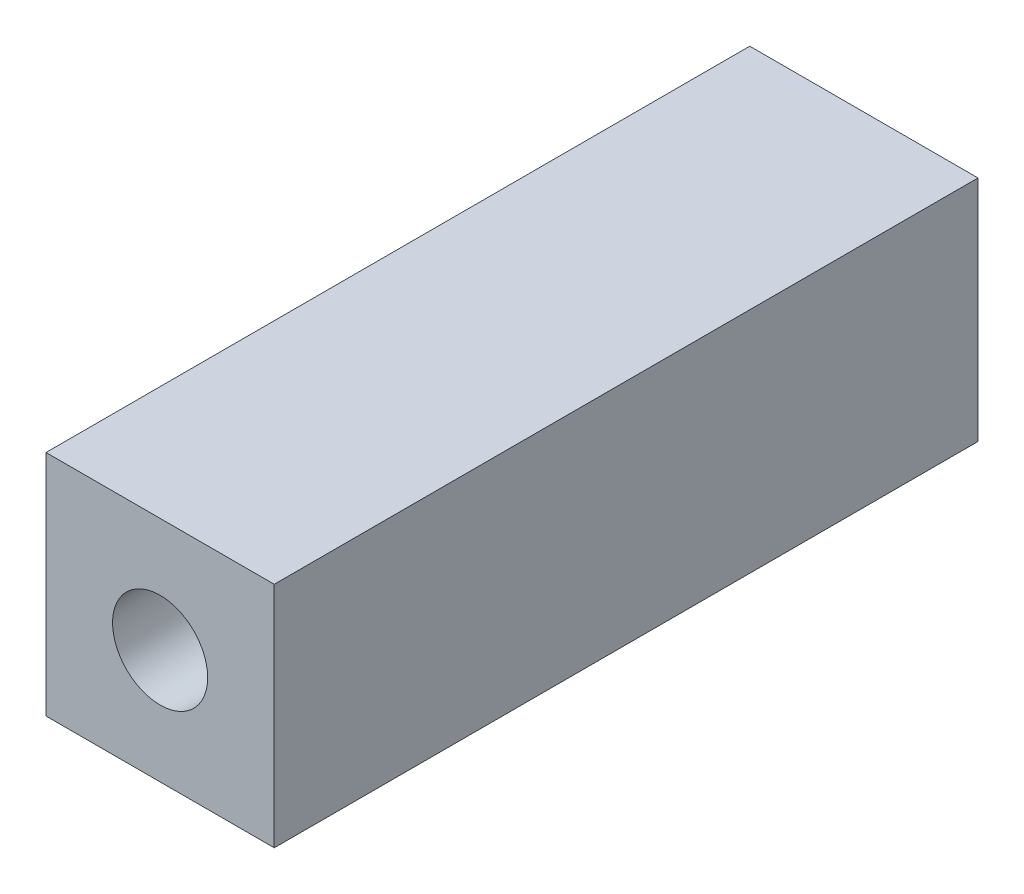
ISO-10303-21;
HEADER;
FILE_DESCRIPTION(('STEP AP214'),'2;1');
FILE_NAME('part.step','',(''),(''),'','','');
FILE_SCHEMA(('AUTOMOTIVE_DESIGN { 1 0 10303 214 1 1 1 1 }'));
ENDSEC;
DATA;
#1=APPLICATION_CONTEXT('core data for automotive mechanical design processes');
#2=APPLICATION_PROTOCOL_DEFINITION('international standard','automotive_design',2000,#1);
#3=PRODUCT_CONTEXT('',#1,'mechanical');
#4=PRODUCT('Part','Part','',(#3));
#5=PRODUCT_RELATED_PRODUCT_CATEGORY('part','',(#4));
#6=PRODUCT_DEFINITION_FORMATION('','',#4);
#7=PRODUCT_DEFINITION_CONTEXT('part definition',#1,'design');
#8=PRODUCT_DEFINITION('design','',#6,#7);
#9=PRODUCT_DEFINITION_SHAPE('','',#8);
#10=(LENGTH_UNIT() NAMED_UNIT(*) SI_UNIT(.MILLI.,.METRE.));
#11=(NAMED_UNIT(*) PLANE_ANGLE_UNIT() SI_UNIT($,.RADIAN.));
#12=(NAMED_UNIT(*) SI_UNIT($,.STERADIAN.) SOLID_ANGLE_UNIT());
#13=UNCERTAINTY_MEASURE_WITH_UNIT(LENGTH_MEASURE(1.E-05),#10,'distance_accuracy_value','');
#14=(GEOMETRIC_REPRESENTATION_CONTEXT(3) GLOBAL_UNCERTAINTY_ASSIGNED_CONTEXT((#13)) GLOBAL_UNIT_ASSIGNED_CONTEXT((#10,
#11,#12)) REPRESENTATION_CONTEXT('',''));
#15=CARTESIAN_POINT('',(0.,0.,0.));
#16=DIRECTION('',(0.,0.,1.));
#17=DIRECTION('',(1.,0.,0.));
#18=AXIS2_PLACEMENT_3D('',#15,#16,#17);
#19=CARTESIAN_POINT('',(6.,6.,37.));
#20=DIRECTION('',(-1.,0.,0.));
#21=DIRECTION('',(0.,-1.,0.));
#22=AXIS2_PLACEMENT_3D('',#19,#20,#21);
#23=PLANE('',#22);
#24=DIRECTION('',(0.,1.,0.));
#25=VECTOR('',#24,1.);
#26=CARTESIAN_POINT('',(6.,6.,0.));
#27=LINE('',#26,#25);
#28=CARTESIAN_POINT('',(6.,-6.,0.));
#29=VERTEX_POINT('',#28);
#30=CARTESIAN_POINT('',(6.,6.,0.));
#31=VERTEX_POINT('',#30);
#32=EDGE_CURVE('E147',#29,#31,#27,.T.);
#33=ORIENTED_EDGE('',*,*,#32,.T.);
#34=DIRECTION('',(0.,0.,-1.));
#35=VECTOR('',#34,1.);
#36=CARTESIAN_POINT('',(6.,6.,37.));
#37=LINE('',#36,#35);
#38=CARTESIAN_POINT('',(6.,6.,37.));
#39=VERTEX_POINT('',#38);
#40=EDGE_CURVE('E11',#39,#31,#37,.T.);
#41=ORIENTED_EDGE('',*,*,#40,.F.);
#42=DIRECTION('',(0.,1.,0.));
#43=VECTOR('',#42,1.);
#44=CARTESIAN_POINT('',(6.,6.,37.));
#45=LINE('',#44,#43);
#46=CARTESIAN_POINT('',(6.,-6.,37.));
#47=VERTEX_POINT('',#46);
#48=EDGE_CURVE('E151',#47,#39,#45,.T.);
#49=ORIENTED_EDGE('',*,*,#48,.F.);
#50=DIRECTION('',(0.,0.,-1.));
#51=VECTOR('',#50,1.);
#52=CARTESIAN_POINT('',(6.,-6.,37.));
#53=LINE('',#52,#51);
#54=EDGE_CURVE('E157',#47,#29,#53,.T.);
#55=ORIENTED_EDGE('',*,*,#54,.T.);
#56=EDGE_LOOP('',(#33,#41,#49,#55));
#57=FACE_BOUND('',#56,.T.);
#58=ADVANCED_FACE('F36',(#57),#23,.F.);
#59=CARTESIAN_POINT('',(-6.,6.,37.));
#60=DIRECTION('',(0.,-1.,0.));
#61=DIRECTION('',(0.,0.,-1.));
#62=AXIS2_PLACEMENT_3D('',#59,#60,#61);
#63=PLANE('',#62);
#64=DIRECTION('',(-1.,0.,0.));
#65=VECTOR('',#64,1.);
#66=CARTESIAN_POINT('',(-6.,6.,0.));
#67=LINE('',#66,#65);
#68=CARTESIAN_POINT('',(-6.,6.,0.));
#69=VERTEX_POINT('',#68);
#70=EDGE_CURVE('E160',#31,#69,#67,.T.);
#71=ORIENTED_EDGE('',*,*,#70,.T.);
#72=DIRECTION('',(0.,0.,-1.));
#73=VECTOR('',#72,1.);
#74=CARTESIAN_POINT('',(-6.,6.,37.));
#75=LINE('',#74,#73);
#76=CARTESIAN_POINT('',(-6.,6.,37.));
#77=VERTEX_POINT('',#76);
#78=EDGE_CURVE('E43',#77,#69,#75,.T.);
#79=ORIENTED_EDGE('',*,*,#78,.F.);
#80=DIRECTION('',(-1.,0.,0.));
#81=VECTOR('',#80,1.);
#82=CARTESIAN_POINT('',(-6.,6.,37.));
#83=LINE('',#82,#81);
#84=EDGE_CURVE('E87',#39,#77,#83,.T.);
#85=ORIENTED_EDGE('',*,*,#84,.F.);
#86=ORIENTED_EDGE('',*,*,#40,.T.);
#87=EDGE_LOOP('',(#71,#79,#85,#86));
#88=FACE_BOUND('',#87,.T.);
#89=ADVANCED_FACE('F189',(#88),#63,.F.);
#90=CARTESIAN_POINT('',(-6.,6.,37.));
#91=DIRECTION('',(1.,0.,0.));
#92=DIRECTION('',(0.,1.,0.));
#93=AXIS2_PLACEMENT_3D('',#90,#91,#92);
#94=PLANE('',#93);
#95=DIRECTION('',(0.,-1.,0.));
#96=VECTOR('',#95,1.);
#97=CARTESIAN_POINT('',(-6.,6.,0.));
#98=LINE('',#97,#96);
#99=CARTESIAN_POINT('',(-6.,-6.,0.));
#100=VERTEX_POINT('',#99);
#101=EDGE_CURVE('E162',#69,#100,#98,.T.);
#102=ORIENTED_EDGE('',*,*,#101,.T.);
#103=DIRECTION('',(0.,0.,-1.));
#104=VECTOR('',#103,1.);
#105=CARTESIAN_POINT('',(-6.,-6.,37.));
#106=LINE('',#105,#104);
#107=CARTESIAN_POINT('',(-6.,-6.,37.));
#108=VERTEX_POINT('',#107);
#109=EDGE_CURVE('E166',#108,#100,#106,.T.);
#110=ORIENTED_EDGE('',*,*,#109,.F.);
#111=DIRECTION('',(0.,-1.,0.));
#112=VECTOR('',#111,1.);
#113=CARTESIAN_POINT('',(-6.,6.,37.));
#114=LINE('',#113,#112);
#115=EDGE_CURVE('E154',#77,#108,#114,.T.);
#116=ORIENTED_EDGE('',*,*,#115,.F.);
#117=ORIENTED_EDGE('',*,*,#78,.T.);
#118=EDGE_LOOP('',(#102,#110,#116,#117));
#119=FACE_BOUND('',#118,.T.);
#120=ADVANCED_FACE('F171',(#119),#94,.F.);
#121=CARTESIAN_POINT('',(-6.,-6.,37.));
#122=DIRECTION('',(0.,1.,0.));
#123=DIRECTION('',(0.,0.,1.));
#124=AXIS2_PLACEMENT_3D('',#121,#122,#123);
#125=PLANE('',#124);
#126=DIRECTION('',(1.,0.,0.));
#127=VECTOR('',#126,1.);
#128=CARTESIAN_POINT('',(-6.,-6.,0.));
#129=LINE('',#128,#127);
#130=EDGE_CURVE('E80',#100,#29,#129,.T.);
#131=ORIENTED_EDGE('',*,*,#130,.T.);
#132=ORIENTED_EDGE('',*,*,#54,.F.);
#133=DIRECTION('',(1.,0.,0.));
#134=VECTOR('',#133,1.);
#135=CARTESIAN_POINT('',(-6.,-6.,37.));
#136=LINE('',#135,#134);
#137=EDGE_CURVE('E59',#108,#47,#136,.T.);
#138=ORIENTED_EDGE('',*,*,#137,.F.);
#139=ORIENTED_EDGE('',*,*,#109,.T.);
#140=EDGE_LOOP('',(#131,#132,#138,#139));
#141=FACE_BOUND('',#140,.T.);
#142=ADVANCED_FACE('F179',(#141),#125,.F.);
#143=CARTESIAN_POINT('',(0.,0.,37.));
#144=DIRECTION('',(0.,0.,1.));
#145=DIRECTION('',(1.,0.,0.));
#146=AXIS2_PLACEMENT_3D('',#143,#144,#145);
#147=PLANE('',#146);
#148=CARTESIAN_POINT('',(0.,0.,37.));
#149=DIRECTION('',(0.,0.,1.));
#150=DIRECTION('',(1.,0.,0.));
#151=AXIS2_PLACEMENT_3D('',#148,#149,#150);
#152=CIRCLE('',#151,2.5);
#153=CARTESIAN_POINT('',(2.5,0.,37.));
#154=VERTEX_POINT('',#153);
#155=EDGE_CURVE('E282',#154,#154,#152,.T.);
#156=ORIENTED_EDGE('',*,*,#155,.F.);
#157=EDGE_LOOP('',(#156));
#158=FACE_BOUND('',#157,.T.);
#159=ORIENTED_EDGE('',*,*,#48,.T.);
#160=ORIENTED_EDGE('',*,*,#84,.T.);
#161=ORIENTED_EDGE('',*,*,#115,.T.);
#162=ORIENTED_EDGE('',*,*,#137,.T.);
#163=EDGE_LOOP('',(#159,#160,#161,#162));
#164=FACE_BOUND('',#163,.T.);
#165=ADVANCED_FACE('F181',(#158,#164),#147,.T.);
#166=CARTESIAN_POINT('',(0.,0.,0.));
#167=DIRECTION('',(0.,0.,1.));
#168=DIRECTION('',(1.,0.,0.));
#169=AXIS2_PLACEMENT_3D('',#166,#167,#168);
#170=PLANE('',#169);
#171=DIRECTION('',(-1.,0.,0.));
#172=VECTOR('',#171,1.);
#173=CARTESIAN_POINT('',(-4.,-4.,0.));
#174=LINE('',#173,#172);
#175=CARTESIAN_POINT('',(4.,-4.,0.));
#176=VERTEX_POINT('',#175);
#177=CARTESIAN_POINT('',(-4.,-4.,0.));
#178=VERTEX_POINT('',#177);
#179=EDGE_CURVE('E141',#176,#178,#174,.T.);
#180=ORIENTED_EDGE('',*,*,#179,.F.);
#181=DIRECTION('',(0.,-1.,0.));
#182=VECTOR('',#181,1.);
#183=CARTESIAN_POINT('',(4.,4.,0.));
#184=LINE('',#183,#182);
#185=CARTESIAN_POINT('',(4.,4.,0.));
#186=VERTEX_POINT('',#185);
#187=EDGE_CURVE('E50',#186,#176,#184,.T.);
#188=ORIENTED_EDGE('',*,*,#187,.F.);
#189=DIRECTION('',(1.,0.,0.));
#190=VECTOR('',#189,1.);
#191=CARTESIAN_POINT('',(-4.,4.,0.));
#192=LINE('',#191,#190);
#193=CARTESIAN_POINT('',(-4.,4.,0.));
#194=VERTEX_POINT('',#193);
#195=EDGE_CURVE('E129',#194,#186,#192,.T.);
#196=ORIENTED_EDGE('',*,*,#195,.F.);
#197=DIRECTION('',(0.,1.,0.));
#198=VECTOR('',#197,1.);
#199=CARTESIAN_POINT('',(-4.,4.,0.));
#200=LINE('',#199,#198);
#201=EDGE_CURVE('E132',#178,#194,#200,.T.);
#202=ORIENTED_EDGE('',*,*,#201,.F.);
#203=EDGE_LOOP('',(#180,#188,#196,#202));
#204=FACE_BOUND('',#203,.T.);
#205=ORIENTED_EDGE('',*,*,#32,.F.);
#206=ORIENTED_EDGE('',*,*,#130,.F.);
#207=ORIENTED_EDGE('',*,*,#101,.F.);
#208=ORIENTED_EDGE('',*,*,#70,.F.);
#209=EDGE_LOOP('',(#205,#206,#207,#208));
#210=FACE_BOUND('',#209,.T.);
#211=ADVANCED_FACE('F175',(#204,#210),#170,.F.);
#212=CARTESIAN_POINT('',(4.,4.,30.));
#213=DIRECTION('',(1.,0.,0.));
#214=DIRECTION('',(0.,1.,0.));
#215=AXIS2_PLACEMENT_3D('',#212,#213,#214);
#216=PLANE('',#215);
#217=ORIENTED_EDGE('',*,*,#187,.T.);
#218=DIRECTION('',(0.,0.,-1.));
#219=VECTOR('',#218,1.);
#220=CARTESIAN_POINT('',(4.,-4.,30.));
#221=LINE('',#220,#219);
#222=CARTESIAN_POINT('',(4.,-4.,30.));
#223=VERTEX_POINT('',#222);
#224=EDGE_CURVE('E107',#223,#176,#221,.T.);
#225=ORIENTED_EDGE('',*,*,#224,.F.);
#226=DIRECTION('',(0.,-1.,0.));
#227=VECTOR('',#226,1.);
#228=CARTESIAN_POINT('',(4.,4.,30.));
#229=LINE('',#228,#227);
#230=CARTESIAN_POINT('',(4.,4.,30.));
#231=VERTEX_POINT('',#230);
#232=EDGE_CURVE('E111',#231,#223,#229,.T.);
#233=ORIENTED_EDGE('',*,*,#232,.F.);
#234=DIRECTION('',(0.,0.,-1.));
#235=VECTOR('',#234,1.);
#236=CARTESIAN_POINT('',(4.,4.,30.));
#237=LINE('',#236,#235);
#238=EDGE_CURVE('E145',#231,#186,#237,.T.);
#239=ORIENTED_EDGE('',*,*,#238,.T.);
#240=EDGE_LOOP('',(#217,#225,#233,#239));
#241=FACE_BOUND('',#240,.T.);
#242=ADVANCED_FACE('F109',(#241),#216,.F.);
#243=CARTESIAN_POINT('',(-4.,4.,30.));
#244=DIRECTION('',(0.,1.,0.));
#245=DIRECTION('',(0.,0.,1.));
#246=AXIS2_PLACEMENT_3D('',#243,#244,#245);
#247=PLANE('',#246);
#248=ORIENTED_EDGE('',*,*,#195,.T.);
#249=ORIENTED_EDGE('',*,*,#238,.F.);
#250=DIRECTION('',(1.,0.,0.));
#251=VECTOR('',#250,1.);
#252=CARTESIAN_POINT('',(-4.,4.,30.));
#253=LINE('',#252,#251);
#254=CARTESIAN_POINT('',(-4.,4.,30.));
#255=VERTEX_POINT('',#254);
#256=EDGE_CURVE('E117',#255,#231,#253,.T.);
#257=ORIENTED_EDGE('',*,*,#256,.F.);
#258=DIRECTION('',(0.,0.,-1.));
#259=VECTOR('',#258,1.);
#260=CARTESIAN_POINT('',(-4.,4.,30.));
#261=LINE('',#260,#259);
#262=EDGE_CURVE('E148',#255,#194,#261,.T.);
#263=ORIENTED_EDGE('',*,*,#262,.T.);
#264=EDGE_LOOP('',(#248,#249,#257,#263));
#265=FACE_BOUND('',#264,.T.);
#266=ADVANCED_FACE('F224',(#265),#247,.F.);
#267=CARTESIAN_POINT('',(-4.,4.,30.));
#268=DIRECTION('',(-1.,0.,0.));
#269=DIRECTION('',(0.,-1.,0.));
#270=AXIS2_PLACEMENT_3D('',#267,#268,#269);
#271=PLANE('',#270);
#272=ORIENTED_EDGE('',*,*,#201,.T.);
#273=ORIENTED_EDGE('',*,*,#262,.F.);
#274=DIRECTION('',(0.,1.,0.));
#275=VECTOR('',#274,1.);
#276=CARTESIAN_POINT('',(-4.,4.,30.));
#277=LINE('',#276,#275);
#278=CARTESIAN_POINT('',(-4.,-4.,30.));
#279=VERTEX_POINT('',#278);
#280=EDGE_CURVE('E125',#279,#255,#277,.T.);
#281=ORIENTED_EDGE('',*,*,#280,.F.);
#282=DIRECTION('',(0.,0.,-1.));
#283=VECTOR('',#282,1.);
#284=CARTESIAN_POINT('',(-4.,-4.,30.));
#285=LINE('',#284,#283);
#286=EDGE_CURVE('E116',#279,#178,#285,.T.);
#287=ORIENTED_EDGE('',*,*,#286,.T.);
#288=EDGE_LOOP('',(#272,#273,#281,#287));
#289=FACE_BOUND('',#288,.T.);
#290=ADVANCED_FACE('F233',(#289),#271,.F.);
#291=CARTESIAN_POINT('',(-4.,-4.,30.));
#292=DIRECTION('',(0.,-1.,0.));
#293=DIRECTION('',(1.,0.,0.));
#294=AXIS2_PLACEMENT_3D('',#291,#292,#293);
#295=PLANE('',#294);
#296=ORIENTED_EDGE('',*,*,#179,.T.);
#297=ORIENTED_EDGE('',*,*,#286,.F.);
#298=DIRECTION('',(-1.,0.,0.));
#299=VECTOR('',#298,1.);
#300=CARTESIAN_POINT('',(-4.,-4.,30.));
#301=LINE('',#300,#299);
#302=EDGE_CURVE('E120',#223,#279,#301,.T.);
#303=ORIENTED_EDGE('',*,*,#302,.F.);
#304=ORIENTED_EDGE('',*,*,#224,.T.);
#305=EDGE_LOOP('',(#296,#297,#303,#304));
#306=FACE_BOUND('',#305,.T.);
#307=ADVANCED_FACE('F121',(#306),#295,.F.);
#308=CARTESIAN_POINT('',(0.,0.,30.));
#309=DIRECTION('',(0.,0.,1.));
#310=DIRECTION('',(1.,0.,0.));
#311=AXIS2_PLACEMENT_3D('',#308,#309,#310);
#312=PLANE('',#311);
#313=CARTESIAN_POINT('',(0.,0.,30.));
#314=DIRECTION('',(0.,0.,1.));
#315=DIRECTION('',(1.,0.,0.));
#316=AXIS2_PLACEMENT_3D('',#313,#314,#315);
#317=CIRCLE('',#316,2.5);
#318=CARTESIAN_POINT('',(2.5,0.,30.));
#319=VERTEX_POINT('',#318);
#320=EDGE_CURVE('E135',#319,#319,#317,.F.);
#321=ORIENTED_EDGE('',*,*,#320,.F.);
#322=EDGE_LOOP('',(#321));
#323=FACE_BOUND('',#322,.T.);
#324=ORIENTED_EDGE('',*,*,#232,.T.);
#325=ORIENTED_EDGE('',*,*,#302,.T.);
#326=ORIENTED_EDGE('',*,*,#280,.T.);
#327=ORIENTED_EDGE('',*,*,#256,.T.);
#328=EDGE_LOOP('',(#324,#325,#326,#327));
#329=FACE_BOUND('',#328,.T.);
#330=ADVANCED_FACE('F127',(#323,#329),#312,.F.);
#331=CARTESIAN_POINT('',(0.,0.,-0.001000000000001));
#332=DIRECTION('',(0.,0.,1.));
#333=DIRECTION('',(1.,0.,0.));
#334=AXIS2_PLACEMENT_3D('',#331,#332,#333);
#335=CYLINDRICAL_SURFACE('',#334,2.5);
#336=ORIENTED_EDGE('',*,*,#155,.T.);
#337=EDGE_LOOP('',(#336));
#338=FACE_BOUND('',#337,.T.);
#339=ORIENTED_EDGE('',*,*,#320,.T.);
#340=EDGE_LOOP('',(#339));
#341=FACE_BOUND('',#340,.T.);
#342=ADVANCED_FACE('F265',(#338,#341),#335,.F.);
#343=CLOSED_SHELL('',(#58,#89,#120,#142,#165,#211,#242,#266,#290,#307,#330,#342));
#344=MANIFOLD_SOLID_BREP('B2',#343);
#345=ADVANCED_BREP_SHAPE_REPRESENTATION('',(#18,#344),#14);
#346=SHAPE_DEFINITION_REPRESENTATION(#9,#345);
ENDSEC;
END-ISO-10303-21;
